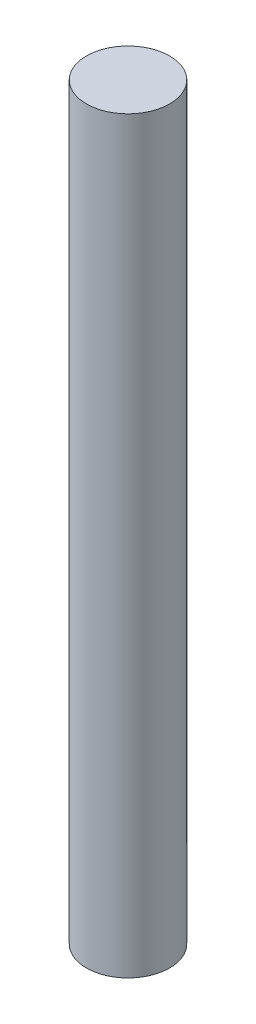
ISO-10303-21;
HEADER;
FILE_DESCRIPTION(('STEP AP214'),'2;1');
FILE_NAME('part.step','',(''),(''),'','','');
FILE_SCHEMA(('AUTOMOTIVE_DESIGN { 1 0 10303 214 1 1 1 1 }'));
ENDSEC;
DATA;
#1=APPLICATION_CONTEXT('core data for automotive mechanical design processes');
#2=APPLICATION_PROTOCOL_DEFINITION('international standard','automotive_design',2000,#1);
#3=PRODUCT_CONTEXT('',#1,'mechanical');
#4=PRODUCT('Part','Part','',(#3));
#5=PRODUCT_RELATED_PRODUCT_CATEGORY('part','',(#4));
#6=PRODUCT_DEFINITION_FORMATION('','',#4);
#7=PRODUCT_DEFINITION_CONTEXT('part definition',#1,'design');
#8=PRODUCT_DEFINITION('design','',#6,#7);
#9=PRODUCT_DEFINITION_SHAPE('','',#8);
#10=(LENGTH_UNIT() NAMED_UNIT(*) SI_UNIT(.MILLI.,.METRE.));
#11=(NAMED_UNIT(*) PLANE_ANGLE_UNIT() SI_UNIT($,.RADIAN.));
#12=(NAMED_UNIT(*) SI_UNIT($,.STERADIAN.) SOLID_ANGLE_UNIT());
#13=UNCERTAINTY_MEASURE_WITH_UNIT(LENGTH_MEASURE(1.E-05),#10,'distance_accuracy_value','');
#14=(GEOMETRIC_REPRESENTATION_CONTEXT(3) GLOBAL_UNCERTAINTY_ASSIGNED_CONTEXT((#13)) GLOBAL_UNIT_ASSIGNED_CONTEXT((#10,
#11,#12)) REPRESENTATION_CONTEXT('',''));
#15=CARTESIAN_POINT('',(0.,0.,0.));
#16=DIRECTION('',(0.,0.,1.));
#17=DIRECTION('',(1.,0.,0.));
#18=AXIS2_PLACEMENT_3D('',#15,#16,#17);
#19=CARTESIAN_POINT('',(0.,45.,0.));
#20=DIRECTION('',(0.,-1.,0.));
#21=DIRECTION('',(0.,0.,-1.));
#22=AXIS2_PLACEMENT_3D('',#19,#20,#21);
#23=CYLINDRICAL_SURFACE('',#22,2.5);
#24=CARTESIAN_POINT('',(0.,45.,0.));
#25=DIRECTION('',(0.,1.,0.));
#26=DIRECTION('',(0.,0.,1.));
#27=AXIS2_PLACEMENT_3D('',#24,#25,#26);
#28=CIRCLE('',#27,2.5);
#29=CARTESIAN_POINT('',(0.,45.,-2.5));
#30=VERTEX_POINT('',#29);
#31=EDGE_CURVE('E10',#30,#30,#28,.T.);
#32=CARTESIAN_POINT('',(0.,0.,0.));
#33=DIRECTION('',(0.,1.,0.));
#34=DIRECTION('',(0.,0.,1.));
#35=AXIS2_PLACEMENT_3D('',#32,#33,#34);
#36=CIRCLE('',#35,2.5);
#37=CARTESIAN_POINT('',(0.,0.,-2.5));
#38=VERTEX_POINT('',#37);
#39=EDGE_CURVE('E36',#38,#38,#36,.T.);
#40=CARTESIAN_POINT('',(0.,45.,-2.5));
#41=CARTESIAN_POINT('',(0.,44.53125,-2.5));
#42=CARTESIAN_POINT('',(0.,44.0625,-2.5));
#43=CARTESIAN_POINT('',(0.,43.125,-2.5));
#44=CARTESIAN_POINT('',(0.,42.65625,-2.5));
#45=CARTESIAN_POINT('',(0.,41.71875,-2.5));
#46=CARTESIAN_POINT('',(0.,41.25,-2.5));
#47=CARTESIAN_POINT('',(0.,40.3125,-2.5));
#48=CARTESIAN_POINT('',(0.,39.84375,-2.5));
#49=CARTESIAN_POINT('',(0.,38.90625,-2.5));
#50=CARTESIAN_POINT('',(0.,38.4375,-2.5));
#51=CARTESIAN_POINT('',(0.,37.5,-2.5));
#52=CARTESIAN_POINT('',(0.,37.03125,-2.5));
#53=CARTESIAN_POINT('',(0.,36.09375,-2.5));
#54=CARTESIAN_POINT('',(0.,35.625,-2.5));
#55=CARTESIAN_POINT('',(0.,34.6875,-2.5));
#56=CARTESIAN_POINT('',(0.,34.21875,-2.5));
#57=CARTESIAN_POINT('',(0.,33.28125,-2.5));
#58=CARTESIAN_POINT('',(0.,32.8125,-2.5));
#59=CARTESIAN_POINT('',(0.,31.875,-2.5));
#60=CARTESIAN_POINT('',(0.,31.40625,-2.5));
#61=CARTESIAN_POINT('',(0.,30.46875,-2.5));
#62=CARTESIAN_POINT('',(0.,30.,-2.5));
#63=CARTESIAN_POINT('',(0.,29.0625,-2.5));
#64=CARTESIAN_POINT('',(0.,28.59375,-2.5));
#65=CARTESIAN_POINT('',(0.,27.65625,-2.5));
#66=CARTESIAN_POINT('',(0.,27.1875,-2.5));
#67=CARTESIAN_POINT('',(0.,26.25,-2.5));
#68=CARTESIAN_POINT('',(0.,25.78125,-2.5));
#69=CARTESIAN_POINT('',(0.,24.84375,-2.5));
#70=CARTESIAN_POINT('',(0.,24.375,-2.5));
#71=CARTESIAN_POINT('',(0.,23.4375,-2.5));
#72=CARTESIAN_POINT('',(0.,22.96875,-2.5));
#73=CARTESIAN_POINT('',(0.,22.03125,-2.5));
#74=CARTESIAN_POINT('',(0.,21.5625,-2.5));
#75=CARTESIAN_POINT('',(0.,20.625,-2.5));
#76=CARTESIAN_POINT('',(0.,20.15625,-2.5));
#77=CARTESIAN_POINT('',(0.,19.21875,-2.5));
#78=CARTESIAN_POINT('',(0.,18.75,-2.5));
#79=CARTESIAN_POINT('',(0.,17.8125,-2.5));
#80=CARTESIAN_POINT('',(0.,17.34375,-2.5));
#81=CARTESIAN_POINT('',(0.,16.40625,-2.5));
#82=CARTESIAN_POINT('',(0.,15.9375,-2.5));
#83=CARTESIAN_POINT('',(0.,15.,-2.5));
#84=CARTESIAN_POINT('',(0.,14.53125,-2.5));
#85=CARTESIAN_POINT('',(0.,13.59375,-2.5));
#86=CARTESIAN_POINT('',(0.,13.125,-2.5));
#87=CARTESIAN_POINT('',(0.,12.1875,-2.5));
#88=CARTESIAN_POINT('',(0.,11.71875,-2.5));
#89=CARTESIAN_POINT('',(0.,10.78125,-2.5));
#90=CARTESIAN_POINT('',(0.,10.3125,-2.5));
#91=CARTESIAN_POINT('',(0.,9.37499999999999,-2.5));
#92=CARTESIAN_POINT('',(0.,8.90624999999999,-2.5));
#93=CARTESIAN_POINT('',(0.,7.96874999999999,-2.5));
#94=CARTESIAN_POINT('',(0.,7.5,-2.5));
#95=CARTESIAN_POINT('',(0.,6.56249999999999,-2.5));
#96=CARTESIAN_POINT('',(0.,6.09374999999999,-2.5));
#97=CARTESIAN_POINT('',(0.,5.15624999999999,-2.5));
#98=CARTESIAN_POINT('',(0.,4.68749999999999,-2.5));
#99=CARTESIAN_POINT('',(0.,3.74999999999999,-2.5));
#100=CARTESIAN_POINT('',(0.,3.28124999999999,-2.5));
#101=CARTESIAN_POINT('',(0.,2.34374999999999,-2.5));
#102=CARTESIAN_POINT('',(0.,1.87499999999999,-2.5));
#103=CARTESIAN_POINT('',(0.,0.937499999999992,-2.5));
#104=CARTESIAN_POINT('',(0.,0.468749999999993,-2.5));
#105=CARTESIAN_POINT('',(0.,0.,-2.5));
#106=B_SPLINE_CURVE_WITH_KNOTS('',3,(#40,#41,#42,#43,#44,#45,#46,#47,#48,#49,#50,#51,#52,#53,
#54,#55,#56,#57,#58,#59,#60,#61,#62,#63,#64,#65,#66,#67,#68,#69,#70,#71,#72,#73,#74,#75,#76,#77,
#78,#79,#80,#81,#82,#83,#84,#85,#86,#87,#88,#89,#90,#91,#92,#93,#94,#95,#96,#97,#98,#99,#100,
#101,#102,#103,#104,#105),.UNSPECIFIED.,.F.,.F.,(4,2,2,2,2,2,2,2,2,2,2,2,2,2,2,2,2,2,2,2,2,2,2,
2,2,2,2,2,2,2,2,2,4),(0.,1.40625,2.8125,4.21874999999999,5.625,7.03125,8.43749999999999,9.84375,
11.25,12.65625,14.0625,15.46875,16.875,18.28125,19.6875,21.09375,22.5,23.90625,25.3125,26.71875,
28.125,29.53125,30.9375,32.34375,33.75,35.15625,36.5625,37.96875,39.375,40.78125,42.1875,
43.59375,45.),.UNSPECIFIED.);
#107=EDGE_CURVE('BSEAM34',#30,#38,#106,.T.);
#108=ORIENTED_EDGE('',*,*,#31,.F.);
#109=ORIENTED_EDGE('',*,*,#39,.T.);
#110=ORIENTED_EDGE('',*,*,#107,.T.);
#111=ORIENTED_EDGE('',*,*,#107,.F.);
#112=EDGE_LOOP('',(#108,#110,#109,#111));
#113=FACE_BOUND('',#112,.T.);
#114=ADVANCED_FACE('F34',(#113),#23,.T.);
#115=CARTESIAN_POINT('',(0.,45.,0.));
#116=DIRECTION('',(0.,1.,0.));
#117=DIRECTION('',(0.,0.,1.));
#118=AXIS2_PLACEMENT_3D('',#115,#116,#117);
#119=PLANE('',#118);
#120=ORIENTED_EDGE('',*,*,#31,.T.);
#121=EDGE_LOOP('',(#120));
#122=FACE_BOUND('',#121,.T.);
#123=ADVANCED_FACE('F49',(#122),#119,.T.);
#124=CARTESIAN_POINT('',(0.,0.,0.));
#125=DIRECTION('',(0.,1.,0.));
#126=DIRECTION('',(0.,0.,1.));
#127=AXIS2_PLACEMENT_3D('',#124,#125,#126);
#128=PLANE('',#127);
#129=ORIENTED_EDGE('',*,*,#39,.F.);
#130=EDGE_LOOP('',(#129));
#131=FACE_BOUND('',#130,.T.);
#132=ADVANCED_FACE('F48',(#131),#128,.F.);
#133=CLOSED_SHELL('',(#114,#123,#132));
#134=MANIFOLD_SOLID_BREP('B2',#133);
#135=ADVANCED_BREP_SHAPE_REPRESENTATION('',(#18,#134),#14);
#136=SHAPE_DEFINITION_REPRESENTATION(#9,#135);
ENDSEC;
END-ISO-10303-21;
